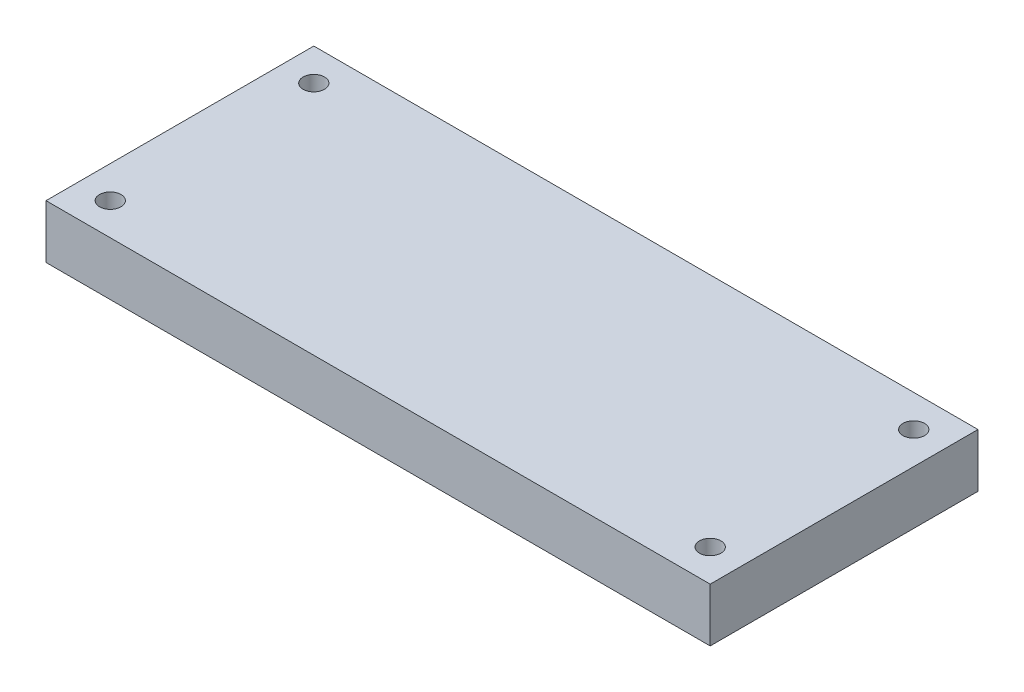
ISO-10303-21;
HEADER;
FILE_DESCRIPTION(('STEP AP214'),'2;1');
FILE_NAME('part.step','',(''),(''),'','','');
FILE_SCHEMA(('AUTOMOTIVE_DESIGN { 1 0 10303 214 1 1 1 1 }'));
ENDSEC;
DATA;
#1=APPLICATION_CONTEXT('core data for automotive mechanical design processes');
#2=APPLICATION_PROTOCOL_DEFINITION('international standard','automotive_design',2000,#1);
#3=PRODUCT_CONTEXT('',#1,'mechanical');
#4=PRODUCT('Part','Part','',(#3));
#5=PRODUCT_RELATED_PRODUCT_CATEGORY('part','',(#4));
#6=PRODUCT_DEFINITION_FORMATION('','',#4);
#7=PRODUCT_DEFINITION_CONTEXT('part definition',#1,'design');
#8=PRODUCT_DEFINITION('design','',#6,#7);
#9=PRODUCT_DEFINITION_SHAPE('','',#8);
#10=(LENGTH_UNIT() NAMED_UNIT(*) SI_UNIT(.MILLI.,.METRE.));
#11=(NAMED_UNIT(*) PLANE_ANGLE_UNIT() SI_UNIT($,.RADIAN.));
#12=(NAMED_UNIT(*) SI_UNIT($,.STERADIAN.) SOLID_ANGLE_UNIT());
#13=UNCERTAINTY_MEASURE_WITH_UNIT(LENGTH_MEASURE(1.E-05),#10,'distance_accuracy_value','');
#14=(GEOMETRIC_REPRESENTATION_CONTEXT(3) GLOBAL_UNCERTAINTY_ASSIGNED_CONTEXT((#13)) GLOBAL_UNIT_ASSIGNED_CONTEXT((#10,
#11,#12)) REPRESENTATION_CONTEXT('',''));
#15=CARTESIAN_POINT('',(0.,0.,0.));
#16=DIRECTION('',(0.,0.,1.));
#17=DIRECTION('',(1.,0.,0.));
#18=AXIS2_PLACEMENT_3D('',#15,#16,#17);
#19=CARTESIAN_POINT('',(31.,5.,12.5));
#20=DIRECTION('',(-1.,0.,0.));
#21=DIRECTION('',(0.,0.,1.));
#22=AXIS2_PLACEMENT_3D('',#19,#20,#21);
#23=PLANE('',#22);
#24=DIRECTION('',(0.,0.,-1.));
#25=VECTOR('',#24,1.);
#26=CARTESIAN_POINT('',(31.,0.,12.5));
#27=LINE('',#26,#25);
#28=CARTESIAN_POINT('',(31.,0.,12.5));
#29=VERTEX_POINT('',#28);
#30=CARTESIAN_POINT('',(31.,0.,-12.5));
#31=VERTEX_POINT('',#30);
#32=EDGE_CURVE('E99',#29,#31,#27,.T.);
#33=ORIENTED_EDGE('',*,*,#32,.T.);
#34=DIRECTION('',(0.,-1.,0.));
#35=VECTOR('',#34,1.);
#36=CARTESIAN_POINT('',(31.,5.,-12.5));
#37=LINE('',#36,#35);
#38=CARTESIAN_POINT('',(31.,5.,-12.5));
#39=VERTEX_POINT('',#38);
#40=EDGE_CURVE('E11',#39,#31,#37,.T.);
#41=ORIENTED_EDGE('',*,*,#40,.F.);
#42=DIRECTION('',(0.,0.,-1.));
#43=VECTOR('',#42,1.);
#44=CARTESIAN_POINT('',(31.,5.,12.5));
#45=LINE('',#44,#43);
#46=CARTESIAN_POINT('',(31.,5.,12.5));
#47=VERTEX_POINT('',#46);
#48=EDGE_CURVE('E87',#47,#39,#45,.T.);
#49=ORIENTED_EDGE('',*,*,#48,.F.);
#50=DIRECTION('',(0.,-1.,0.));
#51=VECTOR('',#50,1.);
#52=CARTESIAN_POINT('',(31.,5.,12.5));
#53=LINE('',#52,#51);
#54=EDGE_CURVE('E95',#47,#29,#53,.T.);
#55=ORIENTED_EDGE('',*,*,#54,.T.);
#56=EDGE_LOOP('',(#33,#41,#49,#55));
#57=FACE_BOUND('',#56,.T.);
#58=ADVANCED_FACE('F36',(#57),#23,.F.);
#59=CARTESIAN_POINT('',(-31.,5.,-12.5));
#60=DIRECTION('',(0.,0.,1.));
#61=DIRECTION('',(1.,0.,0.));
#62=AXIS2_PLACEMENT_3D('',#59,#60,#61);
#63=PLANE('',#62);
#64=DIRECTION('',(-1.,0.,0.));
#65=VECTOR('',#64,1.);
#66=CARTESIAN_POINT('',(-31.,0.,-12.5));
#67=LINE('',#66,#65);
#68=CARTESIAN_POINT('',(-31.,0.,-12.5));
#69=VERTEX_POINT('',#68);
#70=EDGE_CURVE('E91',#31,#69,#67,.T.);
#71=ORIENTED_EDGE('',*,*,#70,.T.);
#72=DIRECTION('',(0.,-1.,0.));
#73=VECTOR('',#72,1.);
#74=CARTESIAN_POINT('',(-31.,5.,-12.5));
#75=LINE('',#74,#73);
#76=CARTESIAN_POINT('',(-31.,5.,-12.5));
#77=VERTEX_POINT('',#76);
#78=EDGE_CURVE('E44',#77,#69,#75,.T.);
#79=ORIENTED_EDGE('',*,*,#78,.F.);
#80=DIRECTION('',(-1.,0.,0.));
#81=VECTOR('',#80,1.);
#82=CARTESIAN_POINT('',(-31.,5.,-12.5));
#83=LINE('',#82,#81);
#84=EDGE_CURVE('E82',#39,#77,#83,.T.);
#85=ORIENTED_EDGE('',*,*,#84,.F.);
#86=ORIENTED_EDGE('',*,*,#40,.T.);
#87=EDGE_LOOP('',(#71,#79,#85,#86));
#88=FACE_BOUND('',#87,.T.);
#89=ADVANCED_FACE('F90',(#88),#63,.F.);
#90=CARTESIAN_POINT('',(-31.,5.,12.5));
#91=DIRECTION('',(1.,0.,0.));
#92=DIRECTION('',(0.,0.,-1.));
#93=AXIS2_PLACEMENT_3D('',#90,#91,#92);
#94=PLANE('',#93);
#95=DIRECTION('',(0.,0.,1.));
#96=VECTOR('',#95,1.);
#97=CARTESIAN_POINT('',(-31.,0.,12.5));
#98=LINE('',#97,#96);
#99=CARTESIAN_POINT('',(-31.,0.,12.5));
#100=VERTEX_POINT('',#99);
#101=EDGE_CURVE('E69',#69,#100,#98,.T.);
#102=ORIENTED_EDGE('',*,*,#101,.T.);
#103=DIRECTION('',(0.,-1.,0.));
#104=VECTOR('',#103,1.);
#105=CARTESIAN_POINT('',(-31.,5.,12.5));
#106=LINE('',#105,#104);
#107=CARTESIAN_POINT('',(-31.,5.,12.5));
#108=VERTEX_POINT('',#107);
#109=EDGE_CURVE('E92',#108,#100,#106,.T.);
#110=ORIENTED_EDGE('',*,*,#109,.F.);
#111=DIRECTION('',(0.,0.,1.));
#112=VECTOR('',#111,1.);
#113=CARTESIAN_POINT('',(-31.,5.,12.5));
#114=LINE('',#113,#112);
#115=EDGE_CURVE('E85',#77,#108,#114,.T.);
#116=ORIENTED_EDGE('',*,*,#115,.F.);
#117=ORIENTED_EDGE('',*,*,#78,.T.);
#118=EDGE_LOOP('',(#102,#110,#116,#117));
#119=FACE_BOUND('',#118,.T.);
#120=ADVANCED_FACE('F93',(#119),#94,.F.);
#121=CARTESIAN_POINT('',(-31.,5.,12.5));
#122=DIRECTION('',(0.,0.,-1.));
#123=DIRECTION('',(-1.,0.,0.));
#124=AXIS2_PLACEMENT_3D('',#121,#122,#123);
#125=PLANE('',#124);
#126=DIRECTION('',(1.,0.,0.));
#127=VECTOR('',#126,1.);
#128=CARTESIAN_POINT('',(-31.,0.,12.5));
#129=LINE('',#128,#127);
#130=EDGE_CURVE('E75',#100,#29,#129,.T.);
#131=ORIENTED_EDGE('',*,*,#130,.T.);
#132=ORIENTED_EDGE('',*,*,#54,.F.);
#133=DIRECTION('',(1.,0.,0.));
#134=VECTOR('',#133,1.);
#135=CARTESIAN_POINT('',(-31.,5.,12.5));
#136=LINE('',#135,#134);
#137=EDGE_CURVE('E52',#108,#47,#136,.T.);
#138=ORIENTED_EDGE('',*,*,#137,.F.);
#139=ORIENTED_EDGE('',*,*,#109,.T.);
#140=EDGE_LOOP('',(#131,#132,#138,#139));
#141=FACE_BOUND('',#140,.T.);
#142=ADVANCED_FACE('F107',(#141),#125,.F.);
#143=CARTESIAN_POINT('',(0.,5.,0.));
#144=DIRECTION('',(0.,-1.,0.));
#145=DIRECTION('',(0.,0.,-1.));
#146=AXIS2_PLACEMENT_3D('',#143,#144,#145);
#147=PLANE('',#146);
#148=CARTESIAN_POINT('',(-28.,5.,9.5));
#149=DIRECTION('',(0.,1.,0.));
#150=DIRECTION('',(0.,0.,1.));
#151=AXIS2_PLACEMENT_3D('',#148,#149,#150);
#152=CIRCLE('',#151,1.);
#153=CARTESIAN_POINT('',(-28.,5.,10.5));
#154=VERTEX_POINT('',#153);
#155=EDGE_CURVE('E126',#154,#154,#152,.T.);
#156=ORIENTED_EDGE('',*,*,#155,.F.);
#157=EDGE_LOOP('',(#156));
#158=FACE_BOUND('',#157,.T.);
#159=CARTESIAN_POINT('',(28.,5.,-9.5));
#160=DIRECTION('',(0.,1.,0.));
#161=DIRECTION('',(0.,0.,1.));
#162=AXIS2_PLACEMENT_3D('',#159,#160,#161);
#163=CIRCLE('',#162,1.);
#164=CARTESIAN_POINT('',(28.,5.,-8.5));
#165=VERTEX_POINT('',#164);
#166=EDGE_CURVE('E119',#165,#165,#163,.T.);
#167=ORIENTED_EDGE('',*,*,#166,.F.);
#168=EDGE_LOOP('',(#167));
#169=FACE_BOUND('',#168,.T.);
#170=CARTESIAN_POINT('',(28.,5.,9.5));
#171=DIRECTION('',(0.,1.,0.));
#172=DIRECTION('',(0.,0.,1.));
#173=AXIS2_PLACEMENT_3D('',#170,#171,#172);
#174=CIRCLE('',#173,1.);
#175=CARTESIAN_POINT('',(28.,5.,10.5));
#176=VERTEX_POINT('',#175);
#177=EDGE_CURVE('E131',#176,#176,#174,.T.);
#178=ORIENTED_EDGE('',*,*,#177,.F.);
#179=EDGE_LOOP('',(#178));
#180=FACE_BOUND('',#179,.T.);
#181=CARTESIAN_POINT('',(-28.,5.,-9.5));
#182=DIRECTION('',(0.,1.,0.));
#183=DIRECTION('',(0.,0.,1.));
#184=AXIS2_PLACEMENT_3D('',#181,#182,#183);
#185=CIRCLE('',#184,1.);
#186=CARTESIAN_POINT('',(-28.,5.,-8.5));
#187=VERTEX_POINT('',#186);
#188=EDGE_CURVE('E113',#187,#187,#185,.T.);
#189=ORIENTED_EDGE('',*,*,#188,.F.);
#190=EDGE_LOOP('',(#189));
#191=FACE_BOUND('',#190,.T.);
#192=ORIENTED_EDGE('',*,*,#48,.T.);
#193=ORIENTED_EDGE('',*,*,#84,.T.);
#194=ORIENTED_EDGE('',*,*,#115,.T.);
#195=ORIENTED_EDGE('',*,*,#137,.T.);
#196=EDGE_LOOP('',(#192,#193,#194,#195));
#197=FACE_BOUND('',#196,.T.);
#198=ADVANCED_FACE('F83',(#158,#169,#180,#191,#197),#147,.F.);
#199=CARTESIAN_POINT('',(0.,0.,0.));
#200=DIRECTION('',(0.,-1.,0.));
#201=DIRECTION('',(0.,0.,-1.));
#202=AXIS2_PLACEMENT_3D('',#199,#200,#201);
#203=PLANE('',#202);
#204=CARTESIAN_POINT('',(-28.,0.,9.5));
#205=DIRECTION('',(0.,1.,0.));
#206=DIRECTION('',(0.,0.,1.));
#207=AXIS2_PLACEMENT_3D('',#204,#205,#206);
#208=CIRCLE('',#207,1.);
#209=CARTESIAN_POINT('',(-28.,0.,10.5));
#210=VERTEX_POINT('',#209);
#211=EDGE_CURVE('E116',#210,#210,#208,.T.);
#212=ORIENTED_EDGE('',*,*,#211,.T.);
#213=EDGE_LOOP('',(#212));
#214=FACE_BOUND('',#213,.T.);
#215=CARTESIAN_POINT('',(28.,0.,-9.5));
#216=DIRECTION('',(0.,1.,0.));
#217=DIRECTION('',(0.,0.,1.));
#218=AXIS2_PLACEMENT_3D('',#215,#216,#217);
#219=CIRCLE('',#218,1.);
#220=CARTESIAN_POINT('',(28.,0.,-8.5));
#221=VERTEX_POINT('',#220);
#222=EDGE_CURVE('E122',#221,#221,#219,.T.);
#223=ORIENTED_EDGE('',*,*,#222,.T.);
#224=EDGE_LOOP('',(#223));
#225=FACE_BOUND('',#224,.T.);
#226=CARTESIAN_POINT('',(28.,0.,9.5));
#227=DIRECTION('',(0.,1.,0.));
#228=DIRECTION('',(0.,0.,1.));
#229=AXIS2_PLACEMENT_3D('',#226,#227,#228);
#230=CIRCLE('',#229,1.);
#231=CARTESIAN_POINT('',(28.,0.,10.5));
#232=VERTEX_POINT('',#231);
#233=EDGE_CURVE('E123',#232,#232,#230,.T.);
#234=ORIENTED_EDGE('',*,*,#233,.T.);
#235=EDGE_LOOP('',(#234));
#236=FACE_BOUND('',#235,.T.);
#237=CARTESIAN_POINT('',(-28.,0.,-9.5));
#238=DIRECTION('',(0.,1.,0.));
#239=DIRECTION('',(0.,0.,1.));
#240=AXIS2_PLACEMENT_3D('',#237,#238,#239);
#241=CIRCLE('',#240,1.);
#242=CARTESIAN_POINT('',(-28.,0.,-8.5));
#243=VERTEX_POINT('',#242);
#244=EDGE_CURVE('E102',#243,#243,#241,.T.);
#245=ORIENTED_EDGE('',*,*,#244,.T.);
#246=EDGE_LOOP('',(#245));
#247=FACE_BOUND('',#246,.T.);
#248=ORIENTED_EDGE('',*,*,#32,.F.);
#249=ORIENTED_EDGE('',*,*,#130,.F.);
#250=ORIENTED_EDGE('',*,*,#101,.F.);
#251=ORIENTED_EDGE('',*,*,#70,.F.);
#252=EDGE_LOOP('',(#248,#249,#250,#251));
#253=FACE_BOUND('',#252,.T.);
#254=ADVANCED_FACE('F110',(#214,#225,#236,#247,#253),#203,.T.);
#255=CARTESIAN_POINT('',(-28.,0.,-9.5));
#256=DIRECTION('',(0.,1.,0.));
#257=DIRECTION('',(0.,0.,1.));
#258=AXIS2_PLACEMENT_3D('',#255,#256,#257);
#259=CYLINDRICAL_SURFACE('',#258,1.);
#260=ORIENTED_EDGE('',*,*,#244,.F.);
#261=EDGE_LOOP('',(#260));
#262=FACE_BOUND('',#261,.T.);
#263=ORIENTED_EDGE('',*,*,#188,.T.);
#264=EDGE_LOOP('',(#263));
#265=FACE_BOUND('',#264,.T.);
#266=ADVANCED_FACE('F143',(#262,#265),#259,.F.);
#267=CARTESIAN_POINT('',(28.,0.,9.5));
#268=DIRECTION('',(0.,1.,0.));
#269=DIRECTION('',(0.,0.,1.));
#270=AXIS2_PLACEMENT_3D('',#267,#268,#269);
#271=CYLINDRICAL_SURFACE('',#270,1.);
#272=ORIENTED_EDGE('',*,*,#233,.F.);
#273=EDGE_LOOP('',(#272));
#274=FACE_BOUND('',#273,.T.);
#275=ORIENTED_EDGE('',*,*,#177,.T.);
#276=EDGE_LOOP('',(#275));
#277=FACE_BOUND('',#276,.T.);
#278=ADVANCED_FACE('F139',(#274,#277),#271,.F.);
#279=CARTESIAN_POINT('',(28.,0.,-9.5));
#280=DIRECTION('',(0.,1.,0.));
#281=DIRECTION('',(0.,0.,1.));
#282=AXIS2_PLACEMENT_3D('',#279,#280,#281);
#283=CYLINDRICAL_SURFACE('',#282,1.);
#284=ORIENTED_EDGE('',*,*,#222,.F.);
#285=EDGE_LOOP('',(#284));
#286=FACE_BOUND('',#285,.T.);
#287=ORIENTED_EDGE('',*,*,#166,.T.);
#288=EDGE_LOOP('',(#287));
#289=FACE_BOUND('',#288,.T.);
#290=ADVANCED_FACE('F142',(#286,#289),#283,.F.);
#291=CARTESIAN_POINT('',(-28.,0.,9.5));
#292=DIRECTION('',(0.,1.,0.));
#293=DIRECTION('',(0.,0.,1.));
#294=AXIS2_PLACEMENT_3D('',#291,#292,#293);
#295=CYLINDRICAL_SURFACE('',#294,1.);
#296=ORIENTED_EDGE('',*,*,#211,.F.);
#297=EDGE_LOOP('',(#296));
#298=FACE_BOUND('',#297,.T.);
#299=ORIENTED_EDGE('',*,*,#155,.T.);
#300=EDGE_LOOP('',(#299));
#301=FACE_BOUND('',#300,.T.);
#302=ADVANCED_FACE('F204',(#298,#301),#295,.F.);
#303=CLOSED_SHELL('',(#58,#89,#120,#142,#198,#254,#266,#278,#290,#302));
#304=MANIFOLD_SOLID_BREP('B2',#303);
#305=ADVANCED_BREP_SHAPE_REPRESENTATION('',(#18,#304),#14);
#306=SHAPE_DEFINITION_REPRESENTATION(#9,#305);
ENDSEC;
END-ISO-10303-21;
